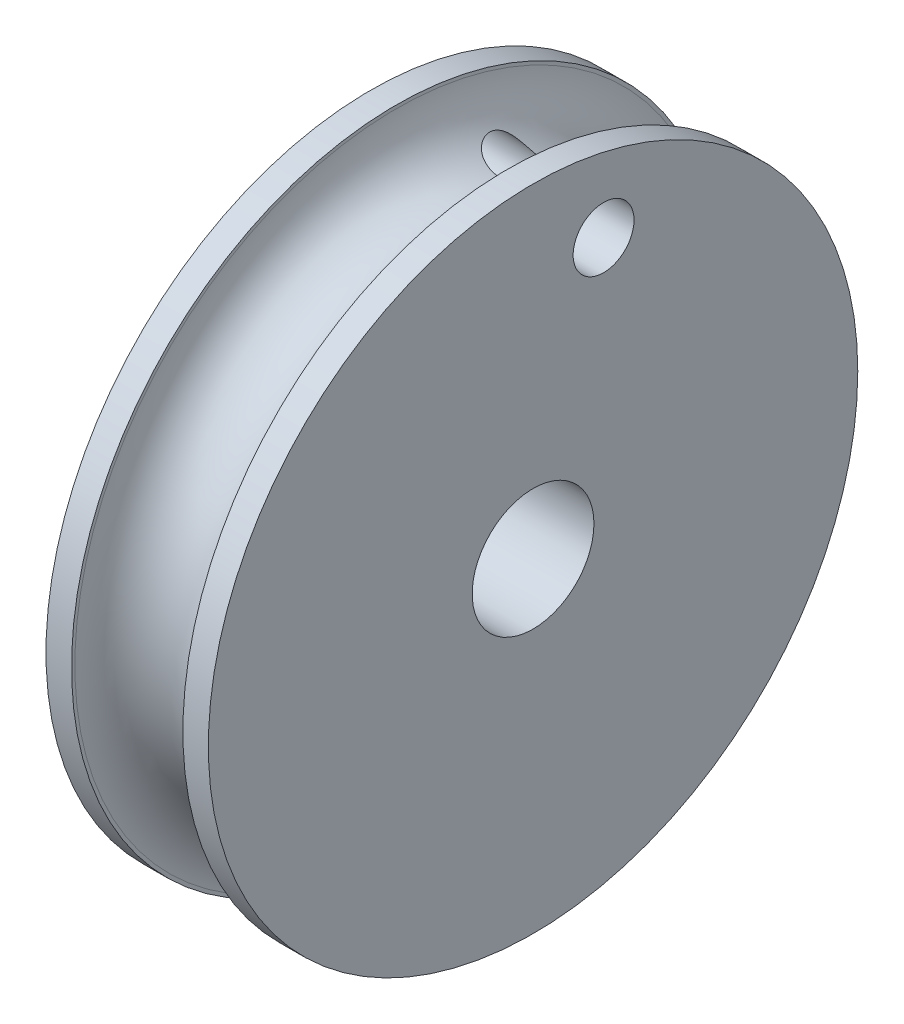
ISO-10303-21;
HEADER;
FILE_DESCRIPTION(('STEP AP214'),'2;1');
FILE_NAME('part.step','',(''),(''),'','','');
FILE_SCHEMA(('AUTOMOTIVE_DESIGN { 1 0 10303 214 1 1 1 1 }'));
ENDSEC;
DATA;
#1=APPLICATION_CONTEXT('core data for automotive mechanical design processes');
#2=APPLICATION_PROTOCOL_DEFINITION('international standard','automotive_design',2000,#1);
#3=PRODUCT_CONTEXT('',#1,'mechanical');
#4=PRODUCT('Part','Part','',(#3));
#5=PRODUCT_RELATED_PRODUCT_CATEGORY('part','',(#4));
#6=PRODUCT_DEFINITION_FORMATION('','',#4);
#7=PRODUCT_DEFINITION_CONTEXT('part definition',#1,'design');
#8=PRODUCT_DEFINITION('design','',#6,#7);
#9=PRODUCT_DEFINITION_SHAPE('','',#8);
#10=(LENGTH_UNIT() NAMED_UNIT(*) SI_UNIT(.MILLI.,.METRE.));
#11=(NAMED_UNIT(*) PLANE_ANGLE_UNIT() SI_UNIT($,.RADIAN.));
#12=(NAMED_UNIT(*) SI_UNIT($,.STERADIAN.) SOLID_ANGLE_UNIT());
#13=UNCERTAINTY_MEASURE_WITH_UNIT(LENGTH_MEASURE(1.E-05),#10,'distance_accuracy_value','');
#14=(GEOMETRIC_REPRESENTATION_CONTEXT(3) GLOBAL_UNCERTAINTY_ASSIGNED_CONTEXT((#13)) GLOBAL_UNIT_ASSIGNED_CONTEXT((#10,
#11,#12)) REPRESENTATION_CONTEXT('',''));
#15=CARTESIAN_POINT('',(0.,0.,0.));
#16=DIRECTION('',(0.,0.,1.));
#17=DIRECTION('',(1.,0.,0.));
#18=AXIS2_PLACEMENT_3D('',#15,#16,#17);
#19=CARTESIAN_POINT('',(0.,0.,12.7));
#20=DIRECTION('',(1.,0.,0.));
#21=DIRECTION('',(0.,0.,-1.));
#22=AXIS2_PLACEMENT_3D('',#19,#20,#21);
#23=TOROIDAL_SURFACE('',#22,25.4,4.35767364214451);
#24=CARTESIAN_POINT('',(-2.41176524563012,20.4815950827567,5.32014187953219));
#25=CARTESIAN_POINT('',(-2.47547169034384,20.5446379575102,5.37024631105741));
#26=CARTESIAN_POINT('',(-2.53398374525606,20.6083447242916,5.42611294712768));
#27=CARTESIAN_POINT('',(-2.63941562806116,20.7338458083084,5.54975194093438));
#28=CARTESIAN_POINT('',(-2.68633864355579,20.7956406473259,5.61752101607253));
#29=CARTESIAN_POINT('',(-2.76787064514667,20.9140862383707,5.76463000037408));
#30=CARTESIAN_POINT('',(-2.80243195047508,20.970716457548,5.84401308322938));
#31=CARTESIAN_POINT('',(-2.85852766996338,21.0753355890826,6.01251881239547));
#32=CARTESIAN_POINT('',(-2.88006264519942,21.1233248735639,6.10164103902206));
#33=CARTESIAN_POINT('',(-2.9092271954923,21.2061053784549,6.28273114742775));
#34=CARTESIAN_POINT('',(-2.91746613565743,21.2414133697803,6.37436520877299));
#35=CARTESIAN_POINT('',(-2.92193688146115,21.300462084952,6.56156064324973));
#36=CARTESIAN_POINT('',(-2.91817083866761,21.3242048806671,6.65712130961355));
#37=CARTESIAN_POINT('',(-2.89892816485935,21.3590724276083,6.84649574417058));
#38=CARTESIAN_POINT('',(-2.883788419086,21.3705375783971,6.94028165668879));
#39=CARTESIAN_POINT('',(-2.84227795044954,21.3823541532372,7.12602650977989));
#40=CARTESIAN_POINT('',(-2.81590830643137,21.3827066446263,7.21798562496336));
#41=CARTESIAN_POINT('',(-2.75170026125433,21.3733261158886,7.39880453710886));
#42=CARTESIAN_POINT('',(-2.71369573760138,21.3634417107953,7.48759714016061));
#43=CARTESIAN_POINT('',(-2.62690251166348,21.3352164348375,7.65826495019496));
#44=CARTESIAN_POINT('',(-2.57811221824831,21.3168743158466,7.74013913409794));
#45=CARTESIAN_POINT('',(-2.46702502114367,21.2726392660846,7.90046514077093));
#46=CARTESIAN_POINT('',(-2.40404360562019,21.2463237995064,7.97832303989));
#47=CARTESIAN_POINT('',(-2.2681716866092,21.1897384987798,8.12319984163399));
#48=CARTESIAN_POINT('',(-2.19527585256372,21.159466537738,8.19021287069975));
#49=CARTESIAN_POINT('',(-2.0638371083795,21.1068417377774,8.29516470835276));
#50=CARTESIAN_POINT('',(-2.00734848985279,21.0847679897419,8.33586866379539));
#51=CARTESIAN_POINT('',(-1.8907758193566,21.0408856721628,8.41196456976924));
#52=CARTESIAN_POINT('',(-1.83069061103189,21.0190771906473,8.44735479889085));
#53=CARTESIAN_POINT('',(-1.70738322588853,20.9764209706975,8.51311629732433));
#54=CARTESIAN_POINT('',(-1.64415599864791,20.955574890226,8.54347912255866));
#55=CARTESIAN_POINT('',(-1.51514082078417,20.9154638359025,8.59944752044824));
#56=CARTESIAN_POINT('',(-1.44935229865777,20.8961992179385,8.62505202393257));
#57=CARTESIAN_POINT('',(-1.2977402631159,20.8548314984883,8.67811562203748));
#58=CARTESIAN_POINT('',(-1.21127448412095,20.8333522878436,8.70423123518417));
#59=CARTESIAN_POINT('',(-1.03576584962378,20.7944099037099,8.75001587317312));
#60=CARTESIAN_POINT('',(-0.946722332876266,20.7769477711518,8.76968322766172));
#61=CARTESIAN_POINT('',(-0.766757094684048,20.7465303259693,8.80313224083686));
#62=CARTESIAN_POINT('',(-0.675834808263574,20.7335763905565,8.81691210124178));
#63=CARTESIAN_POINT('',(-0.49278491689295,20.7125061787725,8.83900021460501));
#64=CARTESIAN_POINT('',(-0.400657386679169,20.7043896038793,8.84730880520832));
#65=CARTESIAN_POINT('',(-0.214773332741704,20.6931163057347,8.8587855527538));
#66=CARTESIAN_POINT('',(-0.121009987090922,20.6900144513759,8.86189685532282));
#67=CARTESIAN_POINT('',(0.0665736350465219,20.6890102022401,8.86290788037299));
#68=CARTESIAN_POINT('',(0.160393912516676,20.691107899998,8.86080751010353));
#69=CARTESIAN_POINT('',(0.347599911951018,20.7004612374974,8.85131977276413));
#70=CARTESIAN_POINT('',(0.440985143090677,20.7077217191491,8.8439274425925));
#71=CARTESIAN_POINT('',(0.626629039050194,20.7272384272356,8.82360540004288));
#72=CARTESIAN_POINT('',(0.718887681640101,20.7394947520853,8.8106755785796));
#73=CARTESIAN_POINT('',(0.907733839676056,20.7696749228703,8.7778044845162));
#74=CARTESIAN_POINT('',(1.00419927905028,20.7879224489408,8.75745283087896));
#75=CARTESIAN_POINT('',(1.19424576303201,20.8291746039025,8.70928974365787));
#76=CARTESIAN_POINT('',(1.2878261515886,20.8521803057514,8.68147662711013));
#77=CARTESIAN_POINT('',(1.47082179325203,20.9020052337578,8.6176427633751));
#78=CARTESIAN_POINT('',(1.56024759256826,20.9288140144662,8.58164433969132));
#79=CARTESIAN_POINT('',(1.73395529170999,20.9850257798231,8.50056542688171));
#80=CARTESIAN_POINT('',(1.81824103202728,21.0144267864512,8.45549182950459));
#81=CARTESIAN_POINT('',(1.99870402443023,21.080918246167,8.34417748170614));
#82=CARTESIAN_POINT('',(2.0932937734933,21.1182512225946,8.27545610525878));
#83=CARTESIAN_POINT('',(2.27014982792879,21.1902814678066,8.12249395761734));
#84=CARTESIAN_POINT('',(2.35242548348408,21.2249807264232,8.03826507088806));
#85=CARTESIAN_POINT('',(2.50281663298553,21.2871700720589,7.85418991232441));
#86=CARTESIAN_POINT('',(2.57080151554633,21.3145942163661,7.75421306486502));
#87=CARTESIAN_POINT('',(2.68954034384232,21.3567066322711,7.54201621911469));
#88=CARTESIAN_POINT('',(2.7403053811581,21.3714031114759,7.42980416351393));
#89=CARTESIAN_POINT('',(2.81760191868862,21.3831640590238,7.21410319630771));
#90=CARTESIAN_POINT('',(2.84652780128076,21.3824044873714,7.11158490939091));
#91=CARTESIAN_POINT('',(2.89045451408692,21.3670342602371,6.90461740248973));
#92=CARTESIAN_POINT('',(2.90546169877076,21.3524299316323,6.80016908588093));
#93=CARTESIAN_POINT('',(2.92078653035126,21.3109784044369,6.60201492998076));
#94=CARTESIAN_POINT('',(2.92224867934788,21.2852826089707,6.50815312872388));
#95=CARTESIAN_POINT('',(2.91346324656903,21.2228113840799,6.32478391538458));
#96=CARTESIAN_POINT('',(2.90321882572344,21.18603894747,6.23527533467678));
#97=CARTESIAN_POINT('',(2.87133093410241,21.1036019770976,6.06449071529695));
#98=CARTESIAN_POINT('',(2.84987696907431,21.0580929971009,5.9831038247566));
#99=CARTESIAN_POINT('',(2.79584609309655,20.9599126734339,5.82880946095324));
#100=CARTESIAN_POINT('',(2.76326913956472,20.9072413023445,5.75590202015357));
#101=CARTESIAN_POINT('',(2.68633194984701,20.7958025423655,5.61796561655451));
#102=CARTESIAN_POINT('',(2.64167392918187,20.7369078653419,5.55320652416285));
#103=CARTESIAN_POINT('',(2.54177192978861,20.6172770673997,5.43451572829746));
#104=CARTESIAN_POINT('',(2.4865260361886,20.5565406150616,5.38058598698659));
#105=CARTESIAN_POINT('',(2.36136055410607,20.430891116822,5.27908720553353));
#106=CARTESIAN_POINT('',(2.290587150897,20.366068668395,5.23246548997633));
#107=CARTESIAN_POINT('',(2.1394614754435,20.240620007262,5.15041338571757));
#108=CARTESIAN_POINT('',(2.05910198017537,20.1799970138644,5.11499151028287));
#109=CARTESIAN_POINT('',(1.91343089022371,20.0807181164994,5.06192095382346));
#110=CARTESIAN_POINT('',(1.8499206695473,20.0405528334993,5.04205605799476));
#111=CARTESIAN_POINT('',(1.71938431895611,19.9641882158935,5.00661789216696));
#112=CARTESIAN_POINT('',(1.65235686980929,19.9279903853404,4.99104624636273));
#113=CARTESIAN_POINT('',(1.51533684488888,19.8599447317767,4.96348290898113));
#114=CARTESIAN_POINT('',(1.44534106812866,19.8281017697315,4.95149520043232));
#115=CARTESIAN_POINT('',(1.30297827805875,19.7690515764161,4.93047761174037));
#116=CARTESIAN_POINT('',(1.23061032099607,19.7418462175356,4.92144892492417));
#117=CARTESIAN_POINT('',(1.00805984055532,19.6665517161044,4.89765600581604));
#118=CARTESIAN_POINT('',(0.854864077566704,19.6259921345678,4.8866276837646));
#119=CARTESIAN_POINT('',(0.544229113253263,19.5653270126261,4.87095701962643));
#120=CARTESIAN_POINT('',(0.386789440307783,19.5452237552072,4.86631539029311));
#121=CARTESIAN_POINT('',(0.132812500143687,19.5293706881372,4.86267294540776));
#122=CARTESIAN_POINT('',(0.0366528140378889,19.5271554696503,4.8621723174105));
#123=CARTESIAN_POINT('',(-0.155569694546321,19.5302666795342,4.86287765924979));
#124=CARTESIAN_POINT('',(-0.251632497780442,19.5355943899594,4.86408391920217));
#125=CARTESIAN_POINT('',(-0.443031294107441,19.5537952411583,4.86836144838089));
#126=CARTESIAN_POINT('',(-0.538367019204842,19.5666710396909,4.87143337454111));
#127=CARTESIAN_POINT('',(-0.727608394846525,19.5999508487195,4.87984101592926));
#128=CARTESIAN_POINT('',(-0.821514299145729,19.6203535067942,4.88517632449991));
#129=CARTESIAN_POINT('',(-0.993816920301039,19.6651489579533,4.89777163639573));
#130=CARTESIAN_POINT('',(-1.07250164182463,19.6885457411457,4.90464442579196));
#131=CARTESIAN_POINT('',(-1.22777958929414,19.7407134375155,4.92105650412298));
#132=CARTESIAN_POINT('',(-1.30437315244804,19.7694834782958,4.93059536032229));
#133=CARTESIAN_POINT('',(-1.454847050773,19.8322021594173,4.95299341304408));
#134=CARTESIAN_POINT('',(-1.52872969029604,19.8661462689177,4.96584971129995));
#135=CARTESIAN_POINT('',(-1.67317375378763,19.9388983933497,4.99564826693715));
#136=CARTESIAN_POINT('',(-1.74373589349264,19.9777053534229,5.01258963891125));
#137=CARTESIAN_POINT('',(-1.92556295858501,20.0864884840125,5.06407063101418));
#138=CARTESIAN_POINT('',(-2.0334232881083,20.1603102127831,5.10288713167277));
#139=CARTESIAN_POINT('',(-2.23444531347984,20.316244468215,5.19785552913504));
#140=CARTESIAN_POINT('',(-2.32763472427936,20.3983408697128,5.25397413205952));
#141=CARTESIAN_POINT('',(-2.41176524563012,20.4815950827567,5.32014187953219));
#142=B_SPLINE_CURVE_WITH_KNOTS('',3,(#24,#25,#26,#27,#28,#29,#30,#31,#32,#33,#34,#35,#36,#37,
#38,#39,#40,#41,#42,#43,#44,#45,#46,#47,#48,#49,#50,#51,#52,#53,#54,#55,#56,#57,#58,#59,#60,#61,
#62,#63,#64,#65,#66,#67,#68,#69,#70,#71,#72,#73,#74,#75,#76,#77,#78,#79,#80,#81,#82,#83,#84,#85,
#86,#87,#88,#89,#90,#91,#92,#93,#94,#95,#96,#97,#98,#99,#100,#101,#102,#103,#104,#105,#106,#107,
#108,#109,#110,#111,#112,#113,#114,#115,#116,#117,#118,#119,#120,#121,#122,#123,#124,#125,#126,
#127,#128,#129,#130,#131,#132,#133,#134,#135,#136,#137,#138,#139,#140,#141),.UNSPECIFIED.,.T.,
.F.,(4,2,2,2,2,2,2,2,2,2,2,2,2,2,2,2,2,2,2,2,2,2,2,2,2,2,2,2,2,2,2,2,2,2,2,2,2,2,2,2,2,2,2,2,2,
2,2,2,2,2,2,2,2,2,2,2,2,2,4),(0.,0.307692578862356,0.615300431424736,0.924082289003421,
1.23285084563911,1.52701934110982,1.82113511781364,2.10686675725336,2.39257095293412,
2.68256136193708,2.97259457926914,3.28200136254351,3.59157516309844,3.81042568295078,
4.02934694831829,4.24863226582409,4.46796679621843,4.74611058156675,5.02432636031966,
5.30262705691081,5.58091057729703,5.86221883777852,6.14353210465622,6.42510954937963,
6.70669254126658,7.00706993529804,7.30751513774195,7.60715057092643,7.90655931138972,
8.27329046663148,8.63974173185042,9.00940909281675,9.37883789090059,9.69666879583468,
10.0143545260904,10.3049239004315,10.5954148357038,10.8811465222719,11.1668793027199,
11.4604234463044,11.754020729059,12.0728944058286,12.3920098866402,12.6248955574915,
12.8578692116434,13.0911008280247,13.3244263876401,13.7992519125571,14.2741304235944,
14.5624132212336,14.8507450235225,15.1391784114205,15.4275599990176,15.6744625636526,
15.92132507621,16.1679726444894,16.4145668018467,16.8216831719325,17.2280209795402),.UNSPECIFIED.);
#143=CARTESIAN_POINT('',(-2.41176524563012,20.4815950827567,5.32014187953219));
#144=VERTEX_POINT('',#143);
#145=EDGE_CURVE('E57',#144,#144,#142,.T.);
#146=ORIENTED_EDGE('',*,*,#145,.F.);
#147=EDGE_LOOP('',(#146));
#148=FACE_BOUND('',#147,.T.);
#149=CARTESIAN_POINT('',(4.35767364214452,0.,12.7));
#150=DIRECTION('',(1.,0.,0.));
#151=DIRECTION('',(0.,0.,-1.));
#152=AXIS2_PLACEMENT_3D('',#149,#150,#151);
#153=CIRCLE('',#152,25.4);
#154=CARTESIAN_POINT('',(4.35767364214451,0.,-12.7));
#155=VERTEX_POINT('',#154);
#156=EDGE_CURVE('E50',#155,#155,#153,.T.);
#157=ORIENTED_EDGE('',*,*,#156,.F.);
#158=EDGE_LOOP('',(#157));
#159=FACE_BOUND('',#158,.T.);
#160=CARTESIAN_POINT('',(-4.35,0.,12.7));
#161=DIRECTION('',(1.,0.,0.));
#162=DIRECTION('',(0.,0.,-1.));
#163=AXIS2_PLACEMENT_3D('',#160,#161,#162);
#164=CIRCLE('',#163,25.141505181017);
#165=CARTESIAN_POINT('',(-4.35,0.,-12.441505181017));
#166=VERTEX_POINT('',#165);
#167=EDGE_CURVE('E10',#166,#166,#164,.T.);
#168=ORIENTED_EDGE('',*,*,#167,.T.);
#169=EDGE_LOOP('',(#168));
#170=FACE_BOUND('',#169,.T.);
#171=ADVANCED_FACE('F31',(#148,#159,#170),#23,.F.);
#172=CARTESIAN_POINT('',(-4.35,0.,0.));
#173=DIRECTION('',(-1.,0.,0.));
#174=DIRECTION('',(0.,0.,1.));
#175=AXIS2_PLACEMENT_3D('',#172,#173,#174);
#176=PLANE('',#175);
#177=ORIENTED_EDGE('',*,*,#167,.F.);
#178=EDGE_LOOP('',(#177));
#179=FACE_BOUND('',#178,.T.);
#180=CARTESIAN_POINT('',(-4.35,0.,12.7));
#181=DIRECTION('',(1.,0.,0.));
#182=DIRECTION('',(0.,0.,-1.));
#183=AXIS2_PLACEMENT_3D('',#180,#181,#182);
#184=CIRCLE('',#183,25.4);
#185=CARTESIAN_POINT('',(-4.35,0.,-12.7));
#186=VERTEX_POINT('',#185);
#187=EDGE_CURVE('E37',#186,#186,#184,.T.);
#188=ORIENTED_EDGE('',*,*,#187,.T.);
#189=EDGE_LOOP('',(#188));
#190=FACE_BOUND('',#189,.T.);
#191=ADVANCED_FACE('F92',(#179,#190),#176,.F.);
#192=CARTESIAN_POINT('',(6.35,0.,12.7));
#193=DIRECTION('',(1.,0.,0.));
#194=DIRECTION('',(0.,0.,-1.));
#195=AXIS2_PLACEMENT_3D('',#192,#193,#194);
#196=CYLINDRICAL_SURFACE('',#195,25.4);
#197=ORIENTED_EDGE('',*,*,#187,.F.);
#198=EDGE_LOOP('',(#197));
#199=FACE_BOUND('',#198,.T.);
#200=CARTESIAN_POINT('',(-6.35,0.,12.7));
#201=DIRECTION('',(1.,0.,0.));
#202=DIRECTION('',(0.,0.,-1.));
#203=AXIS2_PLACEMENT_3D('',#200,#201,#202);
#204=CIRCLE('',#203,25.4);
#205=CARTESIAN_POINT('',(-6.35,0.,-12.7));
#206=VERTEX_POINT('',#205);
#207=EDGE_CURVE('E41',#206,#206,#204,.T.);
#208=ORIENTED_EDGE('',*,*,#207,.T.);
#209=EDGE_LOOP('',(#208));
#210=FACE_BOUND('',#209,.T.);
#211=ADVANCED_FACE('F89',(#199,#210),#196,.T.);
#212=CARTESIAN_POINT('',(-6.35,0.,0.));
#213=DIRECTION('',(1.,0.,0.));
#214=DIRECTION('',(0.,0.,-1.));
#215=AXIS2_PLACEMENT_3D('',#212,#213,#214);
#216=PLANE('',#215);
#217=CARTESIAN_POINT('',(-6.35,19.,7.18433810802443));
#218=DIRECTION('',(1.,0.,0.));
#219=DIRECTION('',(0.,0.,-1.));
#220=AXIS2_PLACEMENT_3D('',#217,#218,#219);
#221=CIRCLE('',#220,2.38125);
#222=CARTESIAN_POINT('',(-6.35,19.,4.80308810802443));
#223=VERTEX_POINT('',#222);
#224=EDGE_CURVE('E66',#223,#223,#221,.F.);
#225=ORIENTED_EDGE('',*,*,#224,.F.);
#226=EDGE_LOOP('',(#225));
#227=FACE_BOUND('',#226,.T.);
#228=CARTESIAN_POINT('',(-6.35,0.,12.7));
#229=DIRECTION('',(1.,0.,0.));
#230=DIRECTION('',(0.,0.,-1.));
#231=AXIS2_PLACEMENT_3D('',#228,#229,#230);
#232=CIRCLE('',#231,4.7625);
#233=CARTESIAN_POINT('',(-6.35,0.,7.9375));
#234=VERTEX_POINT('',#233);
#235=EDGE_CURVE('E53',#234,#234,#232,.T.);
#236=ORIENTED_EDGE('',*,*,#235,.T.);
#237=EDGE_LOOP('',(#236));
#238=FACE_BOUND('',#237,.T.);
#239=ORIENTED_EDGE('',*,*,#207,.F.);
#240=EDGE_LOOP('',(#239));
#241=FACE_BOUND('',#240,.T.);
#242=ADVANCED_FACE('F85',(#227,#238,#241),#216,.F.);
#243=CARTESIAN_POINT('',(6.35,0.,0.));
#244=DIRECTION('',(1.,0.,0.));
#245=DIRECTION('',(0.,0.,-1.));
#246=AXIS2_PLACEMENT_3D('',#243,#244,#245);
#247=PLANE('',#246);
#248=CARTESIAN_POINT('',(6.35,19.,7.18433810802443));
#249=DIRECTION('',(1.,0.,0.));
#250=DIRECTION('',(0.,0.,-1.));
#251=AXIS2_PLACEMENT_3D('',#248,#249,#250);
#252=CIRCLE('',#251,2.38125);
#253=CARTESIAN_POINT('',(6.35,19.,4.80308810802443));
#254=VERTEX_POINT('',#253);
#255=EDGE_CURVE('E172',#254,#254,#252,.T.);
#256=ORIENTED_EDGE('',*,*,#255,.F.);
#257=EDGE_LOOP('',(#256));
#258=FACE_BOUND('',#257,.T.);
#259=CARTESIAN_POINT('',(6.35,0.,12.7));
#260=DIRECTION('',(1.,0.,0.));
#261=DIRECTION('',(0.,0.,-1.));
#262=AXIS2_PLACEMENT_3D('',#259,#260,#261);
#263=CIRCLE('',#262,4.7625);
#264=CARTESIAN_POINT('',(6.35,0.,7.9375));
#265=VERTEX_POINT('',#264);
#266=EDGE_CURVE('E54',#265,#265,#263,.T.);
#267=ORIENTED_EDGE('',*,*,#266,.F.);
#268=EDGE_LOOP('',(#267));
#269=FACE_BOUND('',#268,.T.);
#270=CARTESIAN_POINT('',(6.35,0.,12.7));
#271=DIRECTION('',(1.,0.,0.));
#272=DIRECTION('',(0.,0.,-1.));
#273=AXIS2_PLACEMENT_3D('',#270,#271,#272);
#274=CIRCLE('',#273,25.4);
#275=CARTESIAN_POINT('',(6.35,0.,-12.7));
#276=VERTEX_POINT('',#275);
#277=EDGE_CURVE('E45',#276,#276,#274,.T.);
#278=ORIENTED_EDGE('',*,*,#277,.T.);
#279=EDGE_LOOP('',(#278));
#280=FACE_BOUND('',#279,.T.);
#281=ADVANCED_FACE('F81',(#258,#269,#280),#247,.T.);
#282=CARTESIAN_POINT('',(6.35,0.,12.7));
#283=DIRECTION('',(1.,0.,0.));
#284=DIRECTION('',(0.,0.,-1.));
#285=AXIS2_PLACEMENT_3D('',#282,#283,#284);
#286=CYLINDRICAL_SURFACE('',#285,25.4);
#287=ORIENTED_EDGE('',*,*,#156,.T.);
#288=EDGE_LOOP('',(#287));
#289=FACE_BOUND('',#288,.T.);
#290=ORIENTED_EDGE('',*,*,#277,.F.);
#291=EDGE_LOOP('',(#290));
#292=FACE_BOUND('',#291,.T.);
#293=ADVANCED_FACE('F77',(#289,#292),#286,.T.);
#294=CARTESIAN_POINT('',(-6.35,0.,12.7));
#295=DIRECTION('',(1.,0.,0.));
#296=DIRECTION('',(0.,0.,-1.));
#297=AXIS2_PLACEMENT_3D('',#294,#295,#296);
#298=CYLINDRICAL_SURFACE('',#297,4.7625);
#299=ORIENTED_EDGE('',*,*,#235,.F.);
#300=EDGE_LOOP('',(#299));
#301=FACE_BOUND('',#300,.T.);
#302=ORIENTED_EDGE('',*,*,#266,.T.);
#303=EDGE_LOOP('',(#302));
#304=FACE_BOUND('',#303,.T.);
#305=ADVANCED_FACE('F73',(#301,#304),#298,.F.);
#306=CARTESIAN_POINT('',(-6.35100000000001,19.,7.18433810802443));
#307=DIRECTION('',(1.,0.,0.));
#308=DIRECTION('',(0.,0.,-1.));
#309=AXIS2_PLACEMENT_3D('',#306,#307,#308);
#310=CYLINDRICAL_SURFACE('',#309,2.38125);
#311=ORIENTED_EDGE('',*,*,#224,.T.);
#312=EDGE_LOOP('',(#311));
#313=FACE_BOUND('',#312,.T.);
#314=ORIENTED_EDGE('',*,*,#255,.T.);
#315=EDGE_LOOP('',(#314));
#316=FACE_BOUND('',#315,.T.);
#317=ORIENTED_EDGE('',*,*,#145,.T.);
#318=EDGE_LOOP('',(#317));
#319=FACE_BOUND('',#318,.T.);
#320=ADVANCED_FACE('F68',(#313,#316,#319),#310,.F.);
#321=CLOSED_SHELL('',(#171,#191,#211,#242,#281,#293,#305,#320));
#322=MANIFOLD_SOLID_BREP('B2',#321);
#323=ADVANCED_BREP_SHAPE_REPRESENTATION('',(#18,#322),#14);
#324=SHAPE_DEFINITION_REPRESENTATION(#9,#323);
ENDSEC;
END-ISO-10303-21;
